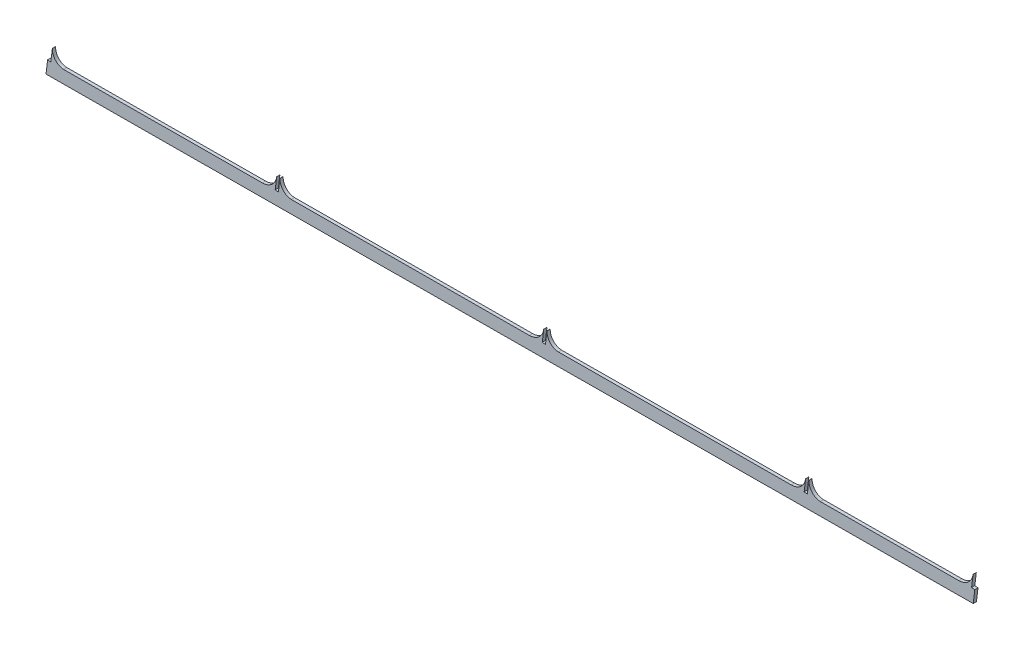
ISO-10303-21;
HEADER;
FILE_DESCRIPTION(('STEP AP214'),'2;1');
FILE_NAME('part.step','',(''),(''),'','','');
FILE_SCHEMA(('AUTOMOTIVE_DESIGN { 1 0 10303 214 1 1 1 1 }'));
ENDSEC;
DATA;
#1=APPLICATION_CONTEXT('core data for automotive mechanical design processes');
#2=APPLICATION_PROTOCOL_DEFINITION('international standard','automotive_design',2000,#1);
#3=PRODUCT_CONTEXT('',#1,'mechanical');
#4=PRODUCT('Part','Part','',(#3));
#5=PRODUCT_RELATED_PRODUCT_CATEGORY('part','',(#4));
#6=PRODUCT_DEFINITION_FORMATION('','',#4);
#7=PRODUCT_DEFINITION_CONTEXT('part definition',#1,'design');
#8=PRODUCT_DEFINITION('design','',#6,#7);
#9=PRODUCT_DEFINITION_SHAPE('','',#8);
#10=(LENGTH_UNIT() NAMED_UNIT(*) SI_UNIT(.MILLI.,.METRE.));
#11=(NAMED_UNIT(*) PLANE_ANGLE_UNIT() SI_UNIT($,.RADIAN.));
#12=(NAMED_UNIT(*) SI_UNIT($,.STERADIAN.) SOLID_ANGLE_UNIT());
#13=UNCERTAINTY_MEASURE_WITH_UNIT(LENGTH_MEASURE(1.E-05),#10,'distance_accuracy_value','');
#14=(GEOMETRIC_REPRESENTATION_CONTEXT(3) GLOBAL_UNCERTAINTY_ASSIGNED_CONTEXT((#13)) GLOBAL_UNIT_ASSIGNED_CONTEXT((#10,
#11,#12)) REPRESENTATION_CONTEXT('',''));
#15=CARTESIAN_POINT('',(0.,0.,0.));
#16=DIRECTION('',(0.,0.,1.));
#17=DIRECTION('',(1.,0.,0.));
#18=AXIS2_PLACEMENT_3D('',#15,#16,#17);
#19=CARTESIAN_POINT('',(571.86296221335,29.8868455378839,2.));
#20=DIRECTION('',(0.,0.,-1.));
#21=DIRECTION('',(-1.,0.,0.));
#22=AXIS2_PLACEMENT_3D('',#19,#20,#21);
#23=CYLINDRICAL_SURFACE('',#22,9.0055703663728);
#24=CARTESIAN_POINT('',(571.86296221335,29.8868455378839,0.));
#25=DIRECTION('',(0.,0.,1.));
#26=DIRECTION('',(1.,0.,0.));
#27=AXIS2_PLACEMENT_3D('',#24,#25,#26);
#28=CIRCLE('',#27,9.0055703663728);
#29=CARTESIAN_POINT('',(571.912079760243,20.8814091192376,0.));
#30=VERTEX_POINT('',#29);
#31=CARTESIAN_POINT('',(580.791756023501,28.7134152163468,0.));
#32=VERTEX_POINT('',#31);
#33=EDGE_CURVE('E248',#30,#32,#28,.T.);
#34=ORIENTED_EDGE('',*,*,#33,.F.);
#35=DIRECTION('',(0.,0.,-1.));
#36=VECTOR('',#35,1.);
#37=CARTESIAN_POINT('',(571.912079760243,20.8814091192376,2.));
#38=LINE('',#37,#36);
#39=CARTESIAN_POINT('',(571.912079760243,20.8814091192376,2.));
#40=VERTEX_POINT('',#39);
#41=EDGE_CURVE('E11',#40,#30,#38,.T.);
#42=ORIENTED_EDGE('',*,*,#41,.F.);
#43=CARTESIAN_POINT('',(571.86296221335,29.8868455378839,2.));
#44=DIRECTION('',(0.,0.,1.));
#45=DIRECTION('',(1.,0.,0.));
#46=AXIS2_PLACEMENT_3D('',#43,#44,#45);
#47=CIRCLE('',#46,9.0055703663728);
#48=CARTESIAN_POINT('',(580.791756023501,28.7134152163468,2.));
#49=VERTEX_POINT('',#48);
#50=EDGE_CURVE('E325',#40,#49,#47,.T.);
#51=ORIENTED_EDGE('',*,*,#50,.T.);
#52=DIRECTION('',(0.,0.,-1.));
#53=VECTOR('',#52,1.);
#54=CARTESIAN_POINT('',(580.791756023501,28.7134152163468,2.));
#55=LINE('',#54,#53);
#56=EDGE_CURVE('E50',#49,#32,#55,.T.);
#57=ORIENTED_EDGE('',*,*,#56,.T.);
#58=EDGE_LOOP('',(#34,#42,#51,#57));
#59=FACE_BOUND('',#58,.T.);
#60=ADVANCED_FACE('F34',(#59),#23,.F.);
#61=CARTESIAN_POINT('',(-0.0968752443684544,17.7615518059578,2.));
#62=DIRECTION('',(-0.00545412948803824,0.999985126125148,0.));
#63=DIRECTION('',(-0.999985126125148,-0.00545412948803824,0.));
#64=AXIS2_PLACEMENT_3D('',#61,#62,#63);
#65=PLANE('',#64);
#66=DIRECTION('',(0.999985126125148,0.00545412948803824,0.));
#67=VECTOR('',#66,1.);
#68=CARTESIAN_POINT('',(-0.0968752443684544,17.7615518059578,0.));
#69=LINE('',#68,#67);
#70=CARTESIAN_POINT('',(485.69022455328,20.4111369614708,0.));
#71=VERTEX_POINT('',#70);
#72=EDGE_CURVE('E250',#71,#30,#69,.T.);
#73=ORIENTED_EDGE('',*,*,#72,.F.);
#74=DIRECTION('',(0.,0.,-1.));
#75=VECTOR('',#74,1.);
#76=CARTESIAN_POINT('',(485.69022455328,20.4111369614708,2.));
#77=LINE('',#76,#75);
#78=CARTESIAN_POINT('',(485.69022455328,20.4111369614708,2.));
#79=VERTEX_POINT('',#78);
#80=EDGE_CURVE('E42',#79,#71,#77,.T.);
#81=ORIENTED_EDGE('',*,*,#80,.F.);
#82=DIRECTION('',(0.999985126125148,0.00545412948803824,0.));
#83=VECTOR('',#82,1.);
#84=CARTESIAN_POINT('',(-0.0968752443684544,17.7615518059578,2.));
#85=LINE('',#84,#83);
#86=EDGE_CURVE('E396',#79,#40,#85,.T.);
#87=ORIENTED_EDGE('',*,*,#86,.T.);
#88=ORIENTED_EDGE('',*,*,#41,.T.);
#89=EDGE_LOOP('',(#73,#81,#87,#88));
#90=FACE_BOUND('',#89,.T.);
#91=ADVANCED_FACE('F385',(#90),#65,.T.);
#92=CARTESIAN_POINT('',(486.110232413012,27.8578242681965,2.));
#93=DIRECTION('',(0.,0.,-1.));
#94=DIRECTION('',(-1.,0.,0.));
#95=AXIS2_PLACEMENT_3D('',#92,#93,#94);
#96=CYLINDRICAL_SURFACE('',#95,7.4585225377676);
#97=CARTESIAN_POINT('',(486.110232413012,27.8578242681965,0.));
#98=DIRECTION('',(0.,0.,1.));
#99=DIRECTION('',(1.,0.,0.));
#100=AXIS2_PLACEMENT_3D('',#97,#98,#99);
#101=CIRCLE('',#100,7.4585225377676);
#102=CARTESIAN_POINT('',(478.665298456165,28.3078429617791,0.));
#103=VERTEX_POINT('',#102);
#104=EDGE_CURVE('E253',#103,#71,#101,.T.);
#105=ORIENTED_EDGE('',*,*,#104,.F.);
#106=DIRECTION('',(0.,0.,-1.));
#107=VECTOR('',#106,1.);
#108=CARTESIAN_POINT('',(478.665298456165,28.3078429617791,2.));
#109=LINE('',#108,#107);
#110=CARTESIAN_POINT('',(478.665298456165,28.3078429617791,2.));
#111=VERTEX_POINT('',#110);
#112=EDGE_CURVE('E374',#111,#103,#109,.T.);
#113=ORIENTED_EDGE('',*,*,#112,.F.);
#114=CARTESIAN_POINT('',(486.110232413012,27.8578242681965,2.));
#115=DIRECTION('',(0.,0.,1.));
#116=DIRECTION('',(1.,0.,0.));
#117=AXIS2_PLACEMENT_3D('',#114,#115,#116);
#118=CIRCLE('',#117,7.4585225377676);
#119=EDGE_CURVE('E381',#111,#79,#118,.T.);
#120=ORIENTED_EDGE('',*,*,#119,.T.);
#121=ORIENTED_EDGE('',*,*,#80,.T.);
#122=EDGE_LOOP('',(#105,#113,#120,#121));
#123=FACE_BOUND('',#122,.T.);
#124=ADVANCED_FACE('F379',(#123),#96,.F.);
#125=CARTESIAN_POINT('',(468.131952417612,-57.4793762221042,2.));
#126=DIRECTION('',(-0.992546151641351,0.121869343404914,0.));
#127=DIRECTION('',(-0.121869343404914,-0.992546151641351,0.));
#128=AXIS2_PLACEMENT_3D('',#125,#126,#127);
#129=PLANE('',#128);
#130=DIRECTION('',(0.121869343404914,0.992546151641351,0.));
#131=VECTOR('',#130,1.);
#132=CARTESIAN_POINT('',(468.131952417612,-57.4793762221042,0.));
#133=LINE('',#132,#131);
#134=CARTESIAN_POINT('',(477.690343708926,20.3674737486484,0.));
#135=VERTEX_POINT('',#134);
#136=EDGE_CURVE('E256',#135,#103,#133,.T.);
#137=ORIENTED_EDGE('',*,*,#136,.F.);
#138=DIRECTION('',(0.,0.,-1.));
#139=VECTOR('',#138,1.);
#140=CARTESIAN_POINT('',(477.690343708926,20.3674737486484,2.));
#141=LINE('',#140,#139);
#142=CARTESIAN_POINT('',(477.690343708926,20.3674737486484,2.));
#143=VERTEX_POINT('',#142);
#144=EDGE_CURVE('E372',#143,#135,#141,.T.);
#145=ORIENTED_EDGE('',*,*,#144,.F.);
#146=DIRECTION('',(0.121869343404914,0.992546151641351,0.));
#147=VECTOR('',#146,1.);
#148=CARTESIAN_POINT('',(468.131952417612,-57.4793762221042,2.));
#149=LINE('',#148,#147);
#150=EDGE_CURVE('E395',#143,#111,#149,.T.);
#151=ORIENTED_EDGE('',*,*,#150,.T.);
#152=ORIENTED_EDGE('',*,*,#112,.T.);
#153=EDGE_LOOP('',(#137,#145,#151,#152));
#154=FACE_BOUND('',#153,.T.);
#155=ADVANCED_FACE('F391',(#154),#129,.T.);
#156=CARTESIAN_POINT('',(9.55839129133681,77.8468499708279,2.));
#157=DIRECTION('',(-0.121869343405077,-0.992546151641331,0.));
#158=DIRECTION('',(0.992546151641331,-0.121869343405077,0.));
#159=AXIS2_PLACEMENT_3D('',#156,#157,#158);
#160=PLANE('',#159);
#161=DIRECTION('',(-0.992546151641331,0.121869343405077,0.));
#162=VECTOR('',#161,1.);
#163=CARTESIAN_POINT('',(9.55839129133681,77.8468499708279,0.));
#164=LINE('',#163,#162);
#165=CARTESIAN_POINT('',(475.708969276083,20.6107559383691,0.));
#166=VERTEX_POINT('',#165);
#167=EDGE_CURVE('E259',#135,#166,#164,.T.);
#168=ORIENTED_EDGE('',*,*,#167,.T.);
#169=DIRECTION('',(0.,0.,-1.));
#170=VECTOR('',#169,1.);
#171=CARTESIAN_POINT('',(475.708969276083,20.6107559383691,2.));
#172=LINE('',#171,#170);
#173=CARTESIAN_POINT('',(475.708969276083,20.6107559383691,2.));
#174=VERTEX_POINT('',#173);
#175=EDGE_CURVE('E370',#174,#166,#172,.T.);
#176=ORIENTED_EDGE('',*,*,#175,.F.);
#177=DIRECTION('',(-0.992546151641331,0.121869343405077,0.));
#178=VECTOR('',#177,1.);
#179=CARTESIAN_POINT('',(9.55839129133681,77.8468499708279,2.));
#180=LINE('',#179,#178);
#181=EDGE_CURVE('E398',#143,#174,#180,.T.);
#182=ORIENTED_EDGE('',*,*,#181,.F.);
#183=ORIENTED_EDGE('',*,*,#144,.T.);
#184=EDGE_LOOP('',(#168,#176,#182,#183));
#185=FACE_BOUND('',#184,.T.);
#186=ADVANCED_FACE('F484',(#185),#160,.F.);
#187=CARTESIAN_POINT('',(466.150577984708,-57.2360940325896,2.));
#188=DIRECTION('',(0.992546151641296,-0.121869343405362,0.));
#189=DIRECTION('',(0.121869343405362,0.992546151641296,0.));
#190=AXIS2_PLACEMENT_3D('',#187,#188,#189);
#191=PLANE('',#190);
#192=DIRECTION('',(-0.121869343405362,-0.992546151641296,0.));
#193=VECTOR('',#192,1.);
#194=CARTESIAN_POINT('',(466.150577984708,-57.2360940325896,0.));
#195=LINE('',#194,#193);
#196=CARTESIAN_POINT('',(476.634048821774,28.1449242318934,0.));
#197=VERTEX_POINT('',#196);
#198=EDGE_CURVE('E262',#197,#166,#195,.T.);
#199=ORIENTED_EDGE('',*,*,#198,.F.);
#200=DIRECTION('',(0.,0.,-1.));
#201=VECTOR('',#200,1.);
#202=CARTESIAN_POINT('',(476.634048821774,28.1449242318934,2.));
#203=LINE('',#202,#201);
#204=CARTESIAN_POINT('',(476.634048821774,28.1449242318934,2.));
#205=VERTEX_POINT('',#204);
#206=EDGE_CURVE('E368',#205,#197,#203,.T.);
#207=ORIENTED_EDGE('',*,*,#206,.F.);
#208=DIRECTION('',(-0.121869343405362,-0.992546151641296,0.));
#209=VECTOR('',#208,1.);
#210=CARTESIAN_POINT('',(466.150577984708,-57.2360940325896,2.));
#211=LINE('',#210,#209);
#212=EDGE_CURVE('E404',#205,#174,#211,.T.);
#213=ORIENTED_EDGE('',*,*,#212,.T.);
#214=ORIENTED_EDGE('',*,*,#175,.T.);
#215=EDGE_LOOP('',(#199,#207,#213,#214));
#216=FACE_BOUND('',#215,.T.);
#217=ADVANCED_FACE('F487',(#216),#191,.T.);
#218=CARTESIAN_POINT('',(467.705255011622,29.3183545534222,2.));
#219=DIRECTION('',(0.,0.,-1.));
#220=DIRECTION('',(-1.,0.,0.));
#221=AXIS2_PLACEMENT_3D('',#218,#219,#220);
#222=CYLINDRICAL_SURFACE('',#221,9.00557036637264);
#223=CARTESIAN_POINT('',(467.705255011622,29.3183545534222,0.));
#224=DIRECTION('',(0.,0.,1.));
#225=DIRECTION('',(1.,0.,0.));
#226=AXIS2_PLACEMENT_3D('',#223,#224,#225);
#227=CIRCLE('',#226,9.00557036637264);
#228=CARTESIAN_POINT('',(467.677868382555,20.3128258295638,0.));
#229=VERTEX_POINT('',#228);
#230=EDGE_CURVE('E265',#229,#197,#227,.T.);
#231=ORIENTED_EDGE('',*,*,#230,.F.);
#232=DIRECTION('',(0.,0.,-1.));
#233=VECTOR('',#232,1.);
#234=CARTESIAN_POINT('',(467.677868382555,20.3128258295638,2.));
#235=LINE('',#234,#233);
#236=CARTESIAN_POINT('',(467.677868382555,20.3128258295638,2.));
#237=VERTEX_POINT('',#236);
#238=EDGE_CURVE('E366',#237,#229,#235,.T.);
#239=ORIENTED_EDGE('',*,*,#238,.F.);
#240=CARTESIAN_POINT('',(467.705255011622,29.3183545534222,2.));
#241=DIRECTION('',(0.,0.,1.));
#242=DIRECTION('',(1.,0.,0.));
#243=AXIS2_PLACEMENT_3D('',#240,#241,#242);
#244=CIRCLE('',#243,9.00557036637264);
#245=EDGE_CURVE('E407',#237,#205,#244,.T.);
#246=ORIENTED_EDGE('',*,*,#245,.T.);
#247=ORIENTED_EDGE('',*,*,#206,.T.);
#248=EDGE_LOOP('',(#231,#239,#246,#247));
#249=FACE_BOUND('',#248,.T.);
#250=ADVANCED_FACE('F491',(#249),#222,.F.);
#251=CARTESIAN_POINT('',(-0.096932242378329,17.7597189682627,2.));
#252=DIRECTION('',(-0.00545790160297811,0.999985105544124,0.));
#253=DIRECTION('',(-0.999985105544124,-0.00545790160297811,0.));
#254=AXIS2_PLACEMENT_3D('',#251,#252,#253);
#255=PLANE('',#254);
#256=DIRECTION('',(0.999985105544124,0.00545790160297811,0.));
#257=VECTOR('',#256,1.);
#258=CARTESIAN_POINT('',(-0.096932242378329,17.7597189682627,0.));
#259=LINE('',#258,#257);
#260=CARTESIAN_POINT('',(322.805939428483,19.5221173191258,0.));
#261=VERTEX_POINT('',#260);
#262=EDGE_CURVE('E268',#261,#229,#259,.T.);
#263=ORIENTED_EDGE('',*,*,#262,.F.);
#264=DIRECTION('',(0.,0.,-1.));
#265=VECTOR('',#264,1.);
#266=CARTESIAN_POINT('',(322.805939428483,19.5221173191258,2.));
#267=LINE('',#266,#265);
#268=CARTESIAN_POINT('',(322.805939428483,19.5221173191258,2.));
#269=VERTEX_POINT('',#268);
#270=EDGE_CURVE('E364',#269,#261,#267,.T.);
#271=ORIENTED_EDGE('',*,*,#270,.F.);
#272=DIRECTION('',(0.999985105544124,0.00545790160297811,0.));
#273=VECTOR('',#272,1.);
#274=CARTESIAN_POINT('',(-0.096932242378329,17.7597189682627,2.));
#275=LINE('',#274,#273);
#276=EDGE_CURVE('E410',#269,#237,#275,.T.);
#277=ORIENTED_EDGE('',*,*,#276,.T.);
#278=ORIENTED_EDGE('',*,*,#238,.T.);
#279=EDGE_LOOP('',(#263,#271,#277,#278));
#280=FACE_BOUND('',#279,.T.);
#281=ADVANCED_FACE('F495',(#280),#255,.T.);
#282=CARTESIAN_POINT('',(323.225947288216,26.9688046258515,2.));
#283=DIRECTION('',(0.,0.,-1.));
#284=DIRECTION('',(-1.,0.,0.));
#285=AXIS2_PLACEMENT_3D('',#282,#283,#284);
#286=CYLINDRICAL_SURFACE('',#285,7.45852253776758);
#287=CARTESIAN_POINT('',(323.225947288216,26.9688046258515,0.));
#288=DIRECTION('',(0.,0.,1.));
#289=DIRECTION('',(1.,0.,0.));
#290=AXIS2_PLACEMENT_3D('',#287,#288,#289);
#291=CIRCLE('',#290,7.45852253776758);
#292=CARTESIAN_POINT('',(315.781013331369,27.4188233194341,0.));
#293=VERTEX_POINT('',#292);
#294=EDGE_CURVE('E271',#293,#261,#291,.T.);
#295=ORIENTED_EDGE('',*,*,#294,.F.);
#296=DIRECTION('',(0.,0.,-1.));
#297=VECTOR('',#296,1.);
#298=CARTESIAN_POINT('',(315.781013331369,27.4188233194341,2.));
#299=LINE('',#298,#297);
#300=CARTESIAN_POINT('',(315.781013331369,27.4188233194341,2.));
#301=VERTEX_POINT('',#300);
#302=EDGE_CURVE('E362',#301,#293,#299,.T.);
#303=ORIENTED_EDGE('',*,*,#302,.F.);
#304=CARTESIAN_POINT('',(323.225947288216,26.9688046258515,2.));
#305=DIRECTION('',(0.,0.,1.));
#306=DIRECTION('',(1.,0.,0.));
#307=AXIS2_PLACEMENT_3D('',#304,#305,#306);
#308=CIRCLE('',#307,7.45852253776758);
#309=EDGE_CURVE('E413',#301,#269,#308,.T.);
#310=ORIENTED_EDGE('',*,*,#309,.T.);
#311=ORIENTED_EDGE('',*,*,#270,.T.);
#312=EDGE_LOOP('',(#295,#303,#310,#311));
#313=FACE_BOUND('',#312,.T.);
#314=ADVANCED_FACE('F499',(#313),#286,.F.);
#315=CARTESIAN_POINT('',(307.774383646617,-37.7899425533892,2.));
#316=DIRECTION('',(-0.992546151641253,0.121869343405711,0.));
#317=DIRECTION('',(-0.121869343405711,-0.992546151641253,0.));
#318=AXIS2_PLACEMENT_3D('',#315,#316,#317);
#319=PLANE('',#318);
#320=DIRECTION('',(0.121869343405711,0.992546151641253,0.));
#321=VECTOR('',#320,1.);
#322=CARTESIAN_POINT('',(307.774383646617,-37.7899425533892,0.));
#323=LINE('',#322,#321);
#324=CARTESIAN_POINT('',(314.806058584123,19.4784541063042,0.));
#325=VERTEX_POINT('',#324);
#326=EDGE_CURVE('E274',#325,#293,#323,.T.);
#327=ORIENTED_EDGE('',*,*,#326,.F.);
#328=DIRECTION('',(0.,0.,-1.));
#329=VECTOR('',#328,1.);
#330=CARTESIAN_POINT('',(314.806058584123,19.4784541063042,2.));
#331=LINE('',#330,#329);
#332=CARTESIAN_POINT('',(314.806058584123,19.4784541063042,2.));
#333=VERTEX_POINT('',#332);
#334=EDGE_CURVE('E360',#333,#325,#331,.T.);
#335=ORIENTED_EDGE('',*,*,#334,.F.);
#336=DIRECTION('',(0.121869343405711,0.992546151641253,0.));
#337=VECTOR('',#336,1.);
#338=CARTESIAN_POINT('',(307.774383646617,-37.7899425533892,2.));
#339=LINE('',#338,#337);
#340=EDGE_CURVE('E416',#333,#301,#339,.T.);
#341=ORIENTED_EDGE('',*,*,#340,.T.);
#342=ORIENTED_EDGE('',*,*,#302,.T.);
#343=EDGE_LOOP('',(#327,#335,#341,#342));
#344=FACE_BOUND('',#343,.T.);
#345=ADVANCED_FACE('F503',(#344),#319,.T.);
#346=CARTESIAN_POINT('',(7.03167493744612,57.2683966595014,2.));
#347=DIRECTION('',(-0.121869343405077,-0.992546151641331,0.));
#348=DIRECTION('',(0.992546151641331,-0.121869343405077,0.));
#349=AXIS2_PLACEMENT_3D('',#346,#347,#348);
#350=PLANE('',#349);
#351=DIRECTION('',(-0.992546151641331,0.121869343405077,0.));
#352=VECTOR('',#351,1.);
#353=CARTESIAN_POINT('',(7.03167493744612,57.2683966595014,0.));
#354=LINE('',#353,#352);
#355=CARTESIAN_POINT('',(312.824684151282,19.7217362960247,0.));
#356=VERTEX_POINT('',#355);
#357=EDGE_CURVE('E277',#325,#356,#354,.T.);
#358=ORIENTED_EDGE('',*,*,#357,.T.);
#359=DIRECTION('',(0.,0.,-1.));
#360=VECTOR('',#359,1.);
#361=CARTESIAN_POINT('',(312.824684151282,19.7217362960247,2.));
#362=LINE('',#361,#360);
#363=CARTESIAN_POINT('',(312.824684151282,19.7217362960247,2.));
#364=VERTEX_POINT('',#363);
#365=EDGE_CURVE('E358',#364,#356,#362,.T.);
#366=ORIENTED_EDGE('',*,*,#365,.F.);
#367=DIRECTION('',(-0.992546151641331,0.121869343405077,0.));
#368=VECTOR('',#367,1.);
#369=CARTESIAN_POINT('',(7.03167493744612,57.2683966595014,2.));
#370=LINE('',#369,#368);
#371=EDGE_CURVE('E419',#333,#364,#370,.T.);
#372=ORIENTED_EDGE('',*,*,#371,.F.);
#373=ORIENTED_EDGE('',*,*,#334,.T.);
#374=EDGE_LOOP('',(#358,#366,#372,#373));
#375=FACE_BOUND('',#374,.T.);
#376=ADVANCED_FACE('F507',(#375),#350,.F.);
#377=CARTESIAN_POINT('',(305.793009213809,-37.5466603635634,2.));
#378=DIRECTION('',(0.992546151641295,-0.121869343405365,0.));
#379=DIRECTION('',(0.121869343405365,0.992546151641295,0.));
#380=AXIS2_PLACEMENT_3D('',#377,#378,#379);
#381=PLANE('',#380);
#382=DIRECTION('',(-0.121869343405365,-0.992546151641295,0.));
#383=VECTOR('',#382,1.);
#384=CARTESIAN_POINT('',(305.793009213809,-37.5466603635634,0.));
#385=LINE('',#384,#383);
#386=CARTESIAN_POINT('',(313.749763696973,27.2559045895474,0.));
#387=VERTEX_POINT('',#386);
#388=EDGE_CURVE('E280',#387,#356,#385,.T.);
#389=ORIENTED_EDGE('',*,*,#388,.F.);
#390=DIRECTION('',(0.,0.,-1.));
#391=VECTOR('',#390,1.);
#392=CARTESIAN_POINT('',(313.749763696973,27.2559045895474,2.));
#393=LINE('',#392,#391);
#394=CARTESIAN_POINT('',(313.749763696973,27.2559045895474,2.));
#395=VERTEX_POINT('',#394);
#396=EDGE_CURVE('E356',#395,#387,#393,.T.);
#397=ORIENTED_EDGE('',*,*,#396,.F.);
#398=DIRECTION('',(-0.121869343405365,-0.992546151641295,0.));
#399=VECTOR('',#398,1.);
#400=CARTESIAN_POINT('',(305.793009213809,-37.5466603635634,2.));
#401=LINE('',#400,#399);
#402=EDGE_CURVE('E421',#395,#364,#401,.T.);
#403=ORIENTED_EDGE('',*,*,#402,.T.);
#404=ORIENTED_EDGE('',*,*,#365,.T.);
#405=EDGE_LOOP('',(#389,#397,#403,#404));
#406=FACE_BOUND('',#405,.T.);
#407=ADVANCED_FACE('F511',(#406),#381,.T.);
#408=CARTESIAN_POINT('',(304.820969886821,28.4293349110772,2.));
#409=DIRECTION('',(0.,0.,-1.));
#410=DIRECTION('',(-1.,0.,0.));
#411=AXIS2_PLACEMENT_3D('',#408,#409,#410);
#412=CYLINDRICAL_SURFACE('',#411,9.00557036637266);
#413=CARTESIAN_POINT('',(304.820969886821,28.4293349110772,0.));
#414=DIRECTION('',(0.,0.,1.));
#415=DIRECTION('',(1.,0.,0.));
#416=AXIS2_PLACEMENT_3D('',#413,#414,#415);
#417=CIRCLE('',#416,9.00557036637266);
#418=CARTESIAN_POINT('',(304.793583257754,19.4238061872189,0.));
#419=VERTEX_POINT('',#418);
#420=EDGE_CURVE('E283',#419,#387,#417,.T.);
#421=ORIENTED_EDGE('',*,*,#420,.F.);
#422=DIRECTION('',(0.,0.,-1.));
#423=VECTOR('',#422,1.);
#424=CARTESIAN_POINT('',(304.793583257754,19.4238061872189,2.));
#425=LINE('',#424,#423);
#426=CARTESIAN_POINT('',(304.793583257754,19.4238061872189,2.));
#427=VERTEX_POINT('',#426);
#428=EDGE_CURVE('E354',#427,#419,#425,.T.);
#429=ORIENTED_EDGE('',*,*,#428,.F.);
#430=CARTESIAN_POINT('',(304.820969886821,28.4293349110772,2.));
#431=DIRECTION('',(0.,0.,1.));
#432=DIRECTION('',(1.,0.,0.));
#433=AXIS2_PLACEMENT_3D('',#430,#431,#432);
#434=CIRCLE('',#433,9.00557036637266);
#435=EDGE_CURVE('E424',#427,#395,#434,.T.);
#436=ORIENTED_EDGE('',*,*,#435,.T.);
#437=ORIENTED_EDGE('',*,*,#396,.T.);
#438=EDGE_LOOP('',(#421,#429,#436,#437));
#439=FACE_BOUND('',#438,.T.);
#440=ADVANCED_FACE('F515',(#439),#412,.F.);
#441=CARTESIAN_POINT('',(-0.0969322423781985,17.7597189682669,2.));
#442=DIRECTION('',(-0.00545790160296949,0.999985105544124,0.));
#443=DIRECTION('',(-0.999985105544124,-0.00545790160296949,0.));
#444=AXIS2_PLACEMENT_3D('',#441,#442,#443);
#445=PLANE('',#444);
#446=DIRECTION('',(0.999985105544124,0.00545790160296949,0.));
#447=VECTOR('',#446,1.);
#448=CARTESIAN_POINT('',(-0.0969322423781985,17.7597189682669,0.));
#449=LINE('',#448,#447);
#450=CARTESIAN_POINT('',(156.683570495634,18.6154242707399,0.));
#451=VERTEX_POINT('',#450);
#452=EDGE_CURVE('E286',#451,#419,#449,.T.);
#453=ORIENTED_EDGE('',*,*,#452,.F.);
#454=DIRECTION('',(0.,0.,-1.));
#455=VECTOR('',#454,1.);
#456=CARTESIAN_POINT('',(156.683570495634,18.6154242707399,2.));
#457=LINE('',#456,#455);
#458=CARTESIAN_POINT('',(156.683570495634,18.6154242707399,2.));
#459=VERTEX_POINT('',#458);
#460=EDGE_CURVE('E352',#459,#451,#457,.T.);
#461=ORIENTED_EDGE('',*,*,#460,.F.);
#462=DIRECTION('',(0.999985105544124,0.00545790160296949,0.));
#463=VECTOR('',#462,1.);
#464=CARTESIAN_POINT('',(-0.0969322423781985,17.7597189682669,2.));
#465=LINE('',#464,#463);
#466=EDGE_CURVE('E427',#459,#427,#465,.T.);
#467=ORIENTED_EDGE('',*,*,#466,.T.);
#468=ORIENTED_EDGE('',*,*,#428,.T.);
#469=EDGE_LOOP('',(#453,#461,#467,#468));
#470=FACE_BOUND('',#469,.T.);
#471=ADVANCED_FACE('F519',(#470),#445,.T.);
#472=CARTESIAN_POINT('',(157.103578355367,26.0621115774657,2.));
#473=DIRECTION('',(0.,0.,-1.));
#474=DIRECTION('',(-1.,0.,0.));
#475=AXIS2_PLACEMENT_3D('',#472,#473,#474);
#476=CYLINDRICAL_SURFACE('',#475,7.45852253776765);
#477=CARTESIAN_POINT('',(157.103578355367,26.0621115774657,0.));
#478=DIRECTION('',(0.,0.,1.));
#479=DIRECTION('',(1.,0.,0.));
#480=AXIS2_PLACEMENT_3D('',#477,#478,#479);
#481=CIRCLE('',#480,7.45852253776765);
#482=CARTESIAN_POINT('',(149.65864439852,26.512130271048,0.));
#483=VERTEX_POINT('',#482);
#484=EDGE_CURVE('E289',#483,#451,#481,.T.);
#485=ORIENTED_EDGE('',*,*,#484,.F.);
#486=DIRECTION('',(0.,0.,-1.));
#487=VECTOR('',#486,1.);
#488=CARTESIAN_POINT('',(149.65864439852,26.512130271048,2.));
#489=LINE('',#488,#487);
#490=CARTESIAN_POINT('',(149.65864439852,26.512130271048,2.));
#491=VERTEX_POINT('',#490);
#492=EDGE_CURVE('E350',#491,#483,#489,.T.);
#493=ORIENTED_EDGE('',*,*,#492,.F.);
#494=CARTESIAN_POINT('',(157.103578355367,26.0621115774657,2.));
#495=DIRECTION('',(0.,0.,1.));
#496=DIRECTION('',(1.,0.,0.));
#497=AXIS2_PLACEMENT_3D('',#494,#495,#496);
#498=CIRCLE('',#497,7.45852253776765);
#499=EDGE_CURVE('E430',#491,#459,#498,.T.);
#500=ORIENTED_EDGE('',*,*,#499,.T.);
#501=ORIENTED_EDGE('',*,*,#460,.T.);
#502=EDGE_LOOP('',(#485,#493,#500,#501));
#503=FACE_BOUND('',#502,.T.);
#504=ADVANCED_FACE('F523',(#503),#476,.F.);
#505=CARTESIAN_POINT('',(144.228961323554,-17.7090896855924,2.));
#506=DIRECTION('',(-0.992546151641324,0.121869343405133,0.));
#507=DIRECTION('',(-0.121869343405133,-0.992546151641324,0.));
#508=AXIS2_PLACEMENT_3D('',#505,#506,#507);
#509=PLANE('',#508);
#510=DIRECTION('',(0.121869343405133,0.992546151641324,0.));
#511=VECTOR('',#510,1.);
#512=CARTESIAN_POINT('',(144.228961323554,-17.7090896855924,0.));
#513=LINE('',#512,#511);
#514=CARTESIAN_POINT('',(148.683689651279,18.5717610579173,0.));
#515=VERTEX_POINT('',#514);
#516=EDGE_CURVE('E292',#515,#483,#513,.T.);
#517=ORIENTED_EDGE('',*,*,#516,.F.);
#518=DIRECTION('',(0.,0.,-1.));
#519=VECTOR('',#518,1.);
#520=CARTESIAN_POINT('',(148.683689651279,18.5717610579173,2.));
#521=LINE('',#520,#519);
#522=CARTESIAN_POINT('',(148.683689651279,18.5717610579173,2.));
#523=VERTEX_POINT('',#522);
#524=EDGE_CURVE('E348',#523,#515,#521,.T.);
#525=ORIENTED_EDGE('',*,*,#524,.F.);
#526=DIRECTION('',(0.121869343405133,0.992546151641324,0.));
#527=VECTOR('',#526,1.);
#528=CARTESIAN_POINT('',(144.228961323554,-17.7090896855924,2.));
#529=LINE('',#528,#527);
#530=EDGE_CURVE('E433',#523,#491,#529,.T.);
#531=ORIENTED_EDGE('',*,*,#530,.T.);
#532=ORIENTED_EDGE('',*,*,#492,.T.);
#533=EDGE_LOOP('',(#517,#525,#531,#532));
#534=FACE_BOUND('',#533,.T.);
#535=ADVANCED_FACE('F527',(#534),#509,.T.);
#536=CARTESIAN_POINT('',(4.45472832772806,36.2808507435173,2.));
#537=DIRECTION('',(-0.121869343405187,-0.992546151641317,0.));
#538=DIRECTION('',(0.992546151641317,-0.121869343405187,0.));
#539=AXIS2_PLACEMENT_3D('',#536,#537,#538);
#540=PLANE('',#539);
#541=DIRECTION('',(-0.992546151641317,0.121869343405187,0.));
#542=VECTOR('',#541,1.);
#543=CARTESIAN_POINT('',(4.45472832772806,36.2808507435173,0.));
#544=LINE('',#543,#542);
#545=CARTESIAN_POINT('',(146.702315218436,18.8150432476383,0.));
#546=VERTEX_POINT('',#545);
#547=EDGE_CURVE('E295',#515,#546,#544,.T.);
#548=ORIENTED_EDGE('',*,*,#547,.T.);
#549=DIRECTION('',(0.,0.,-1.));
#550=VECTOR('',#549,1.);
#551=CARTESIAN_POINT('',(146.702315218436,18.8150432476383,2.));
#552=LINE('',#551,#550);
#553=CARTESIAN_POINT('',(146.702315218436,18.8150432476383,2.));
#554=VERTEX_POINT('',#553);
#555=EDGE_CURVE('E346',#554,#546,#552,.T.);
#556=ORIENTED_EDGE('',*,*,#555,.F.);
#557=DIRECTION('',(-0.992546151641317,0.121869343405187,0.));
#558=VECTOR('',#557,1.);
#559=CARTESIAN_POINT('',(4.45472832772806,36.2808507435173,2.));
#560=LINE('',#559,#558);
#561=EDGE_CURVE('E436',#523,#554,#560,.T.);
#562=ORIENTED_EDGE('',*,*,#561,.F.);
#563=ORIENTED_EDGE('',*,*,#524,.T.);
#564=EDGE_LOOP('',(#548,#556,#562,#563));
#565=FACE_BOUND('',#564,.T.);
#566=ADVANCED_FACE('F531',(#565),#540,.F.);
#567=CARTESIAN_POINT('',(142.247586890697,-17.4658074959058,2.));
#568=DIRECTION('',(0.992546151641294,-0.121869343405379,0.));
#569=DIRECTION('',(0.121869343405379,0.992546151641294,0.));
#570=AXIS2_PLACEMENT_3D('',#567,#568,#569);
#571=PLANE('',#570);
#572=DIRECTION('',(-0.121869343405379,-0.992546151641294,0.));
#573=VECTOR('',#572,1.);
#574=CARTESIAN_POINT('',(142.247586890697,-17.4658074959058,0.));
#575=LINE('',#574,#573);
#576=CARTESIAN_POINT('',(147.627394764126,26.349211541154,0.));
#577=VERTEX_POINT('',#576);
#578=EDGE_CURVE('E298',#577,#546,#575,.T.);
#579=ORIENTED_EDGE('',*,*,#578,.F.);
#580=DIRECTION('',(0.,0.,-1.));
#581=VECTOR('',#580,1.);
#582=CARTESIAN_POINT('',(147.627394764126,26.349211541154,2.));
#583=LINE('',#582,#581);
#584=CARTESIAN_POINT('',(147.627394764126,26.349211541154,2.));
#585=VERTEX_POINT('',#584);
#586=EDGE_CURVE('E344',#585,#577,#583,.T.);
#587=ORIENTED_EDGE('',*,*,#586,.F.);
#588=DIRECTION('',(-0.121869343405379,-0.992546151641294,0.));
#589=VECTOR('',#588,1.);
#590=CARTESIAN_POINT('',(142.247586890697,-17.4658074959058,2.));
#591=LINE('',#590,#589);
#592=EDGE_CURVE('E438',#585,#554,#591,.T.);
#593=ORIENTED_EDGE('',*,*,#592,.T.);
#594=ORIENTED_EDGE('',*,*,#555,.T.);
#595=EDGE_LOOP('',(#579,#587,#593,#594));
#596=FACE_BOUND('',#595,.T.);
#597=ADVANCED_FACE('F535',(#596),#571,.T.);
#598=CARTESIAN_POINT('',(138.698600953975,27.5226418626902,2.));
#599=DIRECTION('',(0.,0.,-1.));
#600=DIRECTION('',(-1.,0.,0.));
#601=AXIS2_PLACEMENT_3D('',#598,#599,#600);
#602=CYLINDRICAL_SURFACE('',#601,9.00557036637265);
#603=CARTESIAN_POINT('',(138.698600953975,27.5226418626902,0.));
#604=DIRECTION('',(0.,0.,1.));
#605=DIRECTION('',(1.,0.,0.));
#606=AXIS2_PLACEMENT_3D('',#603,#604,#605);
#607=CIRCLE('',#606,9.00557036637265);
#608=CARTESIAN_POINT('',(138.671214324908,18.5171131388318,0.));
#609=VERTEX_POINT('',#608);
#610=EDGE_CURVE('E301',#609,#577,#607,.T.);
#611=ORIENTED_EDGE('',*,*,#610,.F.);
#612=DIRECTION('',(0.,0.,-1.));
#613=VECTOR('',#612,1.);
#614=CARTESIAN_POINT('',(138.671214324908,18.5171131388318,2.));
#615=LINE('',#614,#613);
#616=CARTESIAN_POINT('',(138.671214324908,18.5171131388318,2.));
#617=VERTEX_POINT('',#616);
#618=EDGE_CURVE('E342',#617,#609,#615,.T.);
#619=ORIENTED_EDGE('',*,*,#618,.F.);
#620=CARTESIAN_POINT('',(138.698600953975,27.5226418626902,2.));
#621=DIRECTION('',(0.,0.,1.));
#622=DIRECTION('',(1.,0.,0.));
#623=AXIS2_PLACEMENT_3D('',#620,#621,#622);
#624=CIRCLE('',#623,9.00557036637265);
#625=EDGE_CURVE('E441',#617,#585,#624,.T.);
#626=ORIENTED_EDGE('',*,*,#625,.T.);
#627=ORIENTED_EDGE('',*,*,#586,.T.);
#628=EDGE_LOOP('',(#611,#619,#626,#627));
#629=FACE_BOUND('',#628,.T.);
#630=ADVANCED_FACE('F539',(#629),#602,.F.);
#631=CARTESIAN_POINT('',(-0.0969322423781684,17.7597189682673,2.));
#632=DIRECTION('',(-0.00545790160296765,0.999985105544124,0.));
#633=DIRECTION('',(-0.999985105544124,-0.00545790160296765,0.));
#634=AXIS2_PLACEMENT_3D('',#631,#632,#633);
#635=PLANE('',#634);
#636=DIRECTION('',(0.999985105544124,0.00545790160296765,0.));
#637=VECTOR('',#636,1.);
#638=CARTESIAN_POINT('',(-0.0969322423781684,17.7597189682673,0.));
#639=LINE('',#638,#637);
#640=CARTESIAN_POINT('',(15.1250438666505,17.8428002535237,0.));
#641=VERTEX_POINT('',#640);
#642=EDGE_CURVE('E304',#641,#609,#639,.T.);
#643=ORIENTED_EDGE('',*,*,#642,.F.);
#644=DIRECTION('',(0.,0.,-1.));
#645=VECTOR('',#644,1.);
#646=CARTESIAN_POINT('',(15.1250438666505,17.8428002535237,2.));
#647=LINE('',#646,#645);
#648=CARTESIAN_POINT('',(15.1250438666505,17.8428002535237,2.));
#649=VERTEX_POINT('',#648);
#650=EDGE_CURVE('E340',#649,#641,#647,.T.);
#651=ORIENTED_EDGE('',*,*,#650,.F.);
#652=DIRECTION('',(0.999985105544124,0.00545790160296765,0.));
#653=VECTOR('',#652,1.);
#654=CARTESIAN_POINT('',(-0.0969322423781684,17.7597189682673,2.));
#655=LINE('',#654,#653);
#656=EDGE_CURVE('E444',#649,#617,#655,.T.);
#657=ORIENTED_EDGE('',*,*,#656,.T.);
#658=ORIENTED_EDGE('',*,*,#618,.T.);
#659=EDGE_LOOP('',(#643,#651,#657,#658));
#660=FACE_BOUND('',#659,.T.);
#661=ADVANCED_FACE('F543',(#660),#635,.T.);
#662=CARTESIAN_POINT('',(15.5450517263835,25.2894875602495,2.));
#663=DIRECTION('',(0.,0.,-1.));
#664=DIRECTION('',(-1.,0.,0.));
#665=AXIS2_PLACEMENT_3D('',#662,#663,#664);
#666=CYLINDRICAL_SURFACE('',#665,7.45852253776767);
#667=CARTESIAN_POINT('',(15.5450517263835,25.2894875602495,0.));
#668=DIRECTION('',(0.,0.,1.));
#669=DIRECTION('',(1.,0.,0.));
#670=AXIS2_PLACEMENT_3D('',#667,#668,#669);
#671=CIRCLE('',#670,7.45852253776767);
#672=CARTESIAN_POINT('',(8.10011776953644,25.7395062538318,0.));
#673=VERTEX_POINT('',#672);
#674=EDGE_CURVE('E307',#673,#641,#671,.T.);
#675=ORIENTED_EDGE('',*,*,#674,.F.);
#676=DIRECTION('',(0.,0.,-1.));
#677=VECTOR('',#676,1.);
#678=CARTESIAN_POINT('',(8.10011776953644,25.7395062538318,2.));
#679=LINE('',#678,#677);
#680=CARTESIAN_POINT('',(8.10011776953644,25.7395062538318,2.));
#681=VERTEX_POINT('',#680);
#682=EDGE_CURVE('E338',#681,#673,#679,.T.);
#683=ORIENTED_EDGE('',*,*,#682,.F.);
#684=CARTESIAN_POINT('',(15.5450517263835,25.2894875602495,2.));
#685=DIRECTION('',(0.,0.,1.));
#686=DIRECTION('',(1.,0.,0.));
#687=AXIS2_PLACEMENT_3D('',#684,#685,#686);
#688=CIRCLE('',#687,7.45852253776767);
#689=EDGE_CURVE('E447',#681,#649,#688,.T.);
#690=ORIENTED_EDGE('',*,*,#689,.T.);
#691=ORIENTED_EDGE('',*,*,#650,.T.);
#692=EDGE_LOOP('',(#675,#683,#690,#691));
#693=FACE_BOUND('',#692,.T.);
#694=ADVANCED_FACE('F547',(#693),#666,.F.);
#695=CARTESIAN_POINT('',(4.86633863946202,-0.597511253051125,2.));
#696=DIRECTION('',(0.992546151641323,-0.121869343405136,0.));
#697=DIRECTION('',(0.121869343405136,0.992546151641324,0.));
#698=AXIS2_PLACEMENT_3D('',#695,#696,#697);
#699=PLANE('',#698);
#700=DIRECTION('',(-0.121869343405136,-0.992546151641324,0.));
#701=VECTOR('',#700,1.);
#702=CARTESIAN_POINT('',(4.86633863946202,-0.597511253051125,0.));
#703=LINE('',#702,#701);
#704=CARTESIAN_POINT('',(7.12516302229534,17.7991370407011,0.));
#705=VERTEX_POINT('',#704);
#706=EDGE_CURVE('E310',#673,#705,#703,.T.);
#707=ORIENTED_EDGE('',*,*,#706,.T.);
#708=DIRECTION('',(0.,0.,-1.));
#709=VECTOR('',#708,1.);
#710=CARTESIAN_POINT('',(7.12516302229534,17.7991370407011,2.));
#711=LINE('',#710,#709);
#712=CARTESIAN_POINT('',(7.12516302229534,17.7991370407011,2.));
#713=VERTEX_POINT('',#712);
#714=EDGE_CURVE('E335',#713,#705,#711,.T.);
#715=ORIENTED_EDGE('',*,*,#714,.F.);
#716=DIRECTION('',(-0.121869343405136,-0.992546151641324,0.));
#717=VECTOR('',#716,1.);
#718=CARTESIAN_POINT('',(4.86633863946202,-0.597511253051125,2.));
#719=LINE('',#718,#717);
#720=EDGE_CURVE('E450',#681,#713,#719,.T.);
#721=ORIENTED_EDGE('',*,*,#720,.F.);
#722=ORIENTED_EDGE('',*,*,#682,.T.);
#723=EDGE_LOOP('',(#707,#715,#721,#722));
#724=FACE_BOUND('',#723,.T.);
#725=ADVANCED_FACE('F551',(#724),#699,.F.);
#726=CARTESIAN_POINT('',(2.25882438283541,18.3966482937525,2.));
#727=DIRECTION('',(-0.121869343405245,-0.99254615164131,0.));
#728=DIRECTION('',(0.99254615164131,-0.121869343405245,0.));
#729=AXIS2_PLACEMENT_3D('',#726,#727,#728);
#730=PLANE('',#729);
#731=DIRECTION('',(-0.99254615164131,0.121869343405245,0.));
#732=VECTOR('',#731,1.);
#733=CARTESIAN_POINT('',(2.25882438283541,18.3966482937525,0.));
#734=LINE('',#733,#732);
#735=CARTESIAN_POINT('',(5.14378858945139,18.0424192304223,0.));
#736=VERTEX_POINT('',#735);
#737=EDGE_CURVE('E312',#705,#736,#734,.T.);
#738=ORIENTED_EDGE('',*,*,#737,.T.);
#739=DIRECTION('',(0.,0.,-1.));
#740=VECTOR('',#739,1.);
#741=CARTESIAN_POINT('',(5.14378858945139,18.0424192304223,2.));
#742=LINE('',#741,#740);
#743=CARTESIAN_POINT('',(5.14378858945139,18.0424192304223,2.));
#744=VERTEX_POINT('',#743);
#745=EDGE_CURVE('E332',#744,#736,#742,.T.);
#746=ORIENTED_EDGE('',*,*,#745,.F.);
#747=DIRECTION('',(-0.99254615164131,0.121869343405245,0.));
#748=VECTOR('',#747,1.);
#749=CARTESIAN_POINT('',(2.25882438283541,18.3966482937525,2.));
#750=LINE('',#749,#748);
#751=EDGE_CURVE('E452',#713,#744,#750,.T.);
#752=ORIENTED_EDGE('',*,*,#751,.F.);
#753=ORIENTED_EDGE('',*,*,#714,.T.);
#754=EDGE_LOOP('',(#738,#746,#752,#753));
#755=FACE_BOUND('',#754,.T.);
#756=ADVANCED_FACE('F555',(#755),#730,.F.);
#757=CARTESIAN_POINT('',(2.88496420661582,-0.354229063330234,2.));
#758=DIRECTION('',(0.992546151641309,-0.121869343405254,0.));
#759=DIRECTION('',(0.121869343405254,0.992546151641309,0.));
#760=AXIS2_PLACEMENT_3D('',#757,#758,#759);
#761=PLANE('',#760);
#762=DIRECTION('',(-0.121869343405254,-0.992546151641309,0.));
#763=VECTOR('',#762,1.);
#764=CARTESIAN_POINT('',(2.88496420661582,-0.354229063330234,0.));
#765=LINE('',#764,#763);
#766=CARTESIAN_POINT('',(4.13761379303406,9.84778312131002,0.));
#767=VERTEX_POINT('',#766);
#768=EDGE_CURVE('E314',#736,#767,#765,.T.);
#769=ORIENTED_EDGE('',*,*,#768,.T.);
#770=DIRECTION('',(0.,0.,-1.));
#771=VECTOR('',#770,1.);
#772=CARTESIAN_POINT('',(4.13761379303406,9.84778312131002,2.));
#773=LINE('',#772,#771);
#774=CARTESIAN_POINT('',(4.13761379303406,9.84778312131002,2.));
#775=VERTEX_POINT('',#774);
#776=EDGE_CURVE('E329',#775,#767,#773,.T.);
#777=ORIENTED_EDGE('',*,*,#776,.F.);
#778=DIRECTION('',(-0.121869343405254,-0.992546151641309,0.));
#779=VECTOR('',#778,1.);
#780=CARTESIAN_POINT('',(2.88496420661582,-0.354229063330234,2.));
#781=LINE('',#780,#779);
#782=EDGE_CURVE('E243',#744,#775,#781,.T.);
#783=ORIENTED_EDGE('',*,*,#782,.F.);
#784=ORIENTED_EDGE('',*,*,#745,.T.);
#785=EDGE_LOOP('',(#769,#777,#783,#784));
#786=FACE_BOUND('',#785,.T.);
#787=ADVANCED_FACE('F458',(#786),#761,.F.);
#788=CARTESIAN_POINT('',(-0.0536241766385602,9.82490741615575,2.));
#789=DIRECTION('',(-0.00545790160296583,0.999985105544124,0.));
#790=DIRECTION('',(-0.999985105544124,-0.00545790160296583,0.));
#791=AXIS2_PLACEMENT_3D('',#788,#789,#790);
#792=PLANE('',#791);
#793=DIRECTION('',(0.999985105544124,0.00545790160296583,0.));
#794=VECTOR('',#793,1.);
#795=CARTESIAN_POINT('',(-0.0536241766385602,9.82490741615575,0.));
#796=LINE('',#795,#794);
#797=CARTESIAN_POINT('',(580.873096163411,12.9955955199794,0.));
#798=VERTEX_POINT('',#797);
#799=EDGE_CURVE('E316',#767,#798,#796,.T.);
#800=ORIENTED_EDGE('',*,*,#799,.T.);
#801=DIRECTION('',(0.,0.,-1.));
#802=VECTOR('',#801,1.);
#803=CARTESIAN_POINT('',(580.873096163411,12.9955955199794,2.));
#804=LINE('',#803,#802);
#805=CARTESIAN_POINT('',(580.873096163411,12.9955955199794,2.));
#806=VERTEX_POINT('',#805);
#807=EDGE_CURVE('E230',#806,#798,#804,.T.);
#808=ORIENTED_EDGE('',*,*,#807,.F.);
#809=DIRECTION('',(0.999985105544124,0.00545790160296583,0.));
#810=VECTOR('',#809,1.);
#811=CARTESIAN_POINT('',(-0.0536241766385602,9.82490741615575,2.));
#812=LINE('',#811,#810);
#813=EDGE_CURVE('E240',#775,#806,#812,.T.);
#814=ORIENTED_EDGE('',*,*,#813,.F.);
#815=ORIENTED_EDGE('',*,*,#776,.T.);
#816=EDGE_LOOP('',(#800,#808,#814,#815));
#817=FACE_BOUND('',#816,.T.);
#818=ADVANCED_FACE('F462',(#817),#792,.F.);
#819=CARTESIAN_POINT('',(570.673929888419,-70.069947900078,2.));
#820=DIRECTION('',(0.992546151641323,-0.121869343405136,0.));
#821=DIRECTION('',(0.121869343405136,0.992546151641323,0.));
#822=AXIS2_PLACEMENT_3D('',#819,#820,#821);
#823=PLANE('',#822);
#824=DIRECTION('',(-0.121869343405136,-0.992546151641323,0.));
#825=VECTOR('',#824,1.);
#826=CARTESIAN_POINT('',(570.673929888419,-70.069947900078,0.));
#827=LINE('',#826,#825);
#828=CARTESIAN_POINT('',(581.848050910652,20.9359647331099,0.));
#829=VERTEX_POINT('',#828);
#830=EDGE_CURVE('E227',#829,#798,#827,.T.);
#831=ORIENTED_EDGE('',*,*,#830,.F.);
#832=DIRECTION('',(0.,0.,-1.));
#833=VECTOR('',#832,1.);
#834=CARTESIAN_POINT('',(581.848050910652,20.9359647331099,2.));
#835=LINE('',#834,#833);
#836=CARTESIAN_POINT('',(581.848050910652,20.9359647331099,2.));
#837=VERTEX_POINT('',#836);
#838=EDGE_CURVE('E221',#837,#829,#835,.T.);
#839=ORIENTED_EDGE('',*,*,#838,.F.);
#840=DIRECTION('',(-0.121869343405136,-0.992546151641323,0.));
#841=VECTOR('',#840,1.);
#842=CARTESIAN_POINT('',(570.673929888419,-70.069947900078,2.));
#843=LINE('',#842,#841);
#844=EDGE_CURVE('E225',#837,#806,#843,.T.);
#845=ORIENTED_EDGE('',*,*,#844,.T.);
#846=ORIENTED_EDGE('',*,*,#807,.T.);
#847=EDGE_LOOP('',(#831,#839,#845,#846));
#848=FACE_BOUND('',#847,.T.);
#849=ADVANCED_FACE('F223',(#848),#823,.T.);
#850=CARTESIAN_POINT('',(11.1741210222595,91.00591263328,2.));
#851=DIRECTION('',(-0.1218693434053,-0.992546151641303,0.));
#852=DIRECTION('',(0.992546151641303,-0.1218693434053,0.));
#853=AXIS2_PLACEMENT_3D('',#850,#851,#852);
#854=PLANE('',#853);
#855=DIRECTION('',(-0.992546151641303,0.1218693434053,0.));
#856=VECTOR('',#855,1.);
#857=CARTESIAN_POINT('',(11.1741210222595,91.00591263328,0.));
#858=LINE('',#857,#856);
#859=CARTESIAN_POINT('',(579.866676477811,21.1792469228309,0.));
#860=VERTEX_POINT('',#859);
#861=EDGE_CURVE('E320',#829,#860,#858,.T.);
#862=ORIENTED_EDGE('',*,*,#861,.T.);
#863=DIRECTION('',(0.,0.,-1.));
#864=VECTOR('',#863,1.);
#865=CARTESIAN_POINT('',(579.866676477811,21.1792469228309,2.));
#866=LINE('',#865,#864);
#867=CARTESIAN_POINT('',(579.866676477811,21.1792469228309,2.));
#868=VERTEX_POINT('',#867);
#869=EDGE_CURVE('E136',#868,#860,#866,.T.);
#870=ORIENTED_EDGE('',*,*,#869,.F.);
#871=DIRECTION('',(-0.992546151641303,0.1218693434053,0.));
#872=VECTOR('',#871,1.);
#873=CARTESIAN_POINT('',(11.1741210222595,91.00591263328,2.));
#874=LINE('',#873,#872);
#875=EDGE_CURVE('E232',#837,#868,#874,.T.);
#876=ORIENTED_EDGE('',*,*,#875,.F.);
#877=ORIENTED_EDGE('',*,*,#838,.T.);
#878=EDGE_LOOP('',(#862,#870,#876,#877));
#879=FACE_BOUND('',#878,.T.);
#880=ADVANCED_FACE('F233',(#879),#854,.F.);
#881=CARTESIAN_POINT('',(568.69255545554,-69.8266657104878,2.));
#882=DIRECTION('',(0.992546151641295,-0.121869343405369,0.));
#883=DIRECTION('',(0.121869343405369,0.992546151641295,0.));
#884=AXIS2_PLACEMENT_3D('',#881,#882,#883);
#885=PLANE('',#884);
#886=DIRECTION('',(-0.121869343405369,-0.992546151641295,0.));
#887=VECTOR('',#886,1.);
#888=CARTESIAN_POINT('',(568.69255545554,-69.8266657104878,0.));
#889=LINE('',#888,#887);
#890=EDGE_CURVE('E322',#32,#860,#889,.T.);
#891=ORIENTED_EDGE('',*,*,#890,.F.);
#892=ORIENTED_EDGE('',*,*,#56,.F.);
#893=DIRECTION('',(-0.121869343405369,-0.992546151641295,0.));
#894=VECTOR('',#893,1.);
#895=CARTESIAN_POINT('',(568.69255545554,-69.8266657104878,2.));
#896=LINE('',#895,#894);
#897=EDGE_CURVE('E236',#49,#868,#896,.T.);
#898=ORIENTED_EDGE('',*,*,#897,.T.);
#899=ORIENTED_EDGE('',*,*,#869,.T.);
#900=EDGE_LOOP('',(#891,#892,#898,#899));
#901=FACE_BOUND('',#900,.T.);
#902=ADVANCED_FACE('F463',(#901),#885,.T.);
#903=CARTESIAN_POINT('',(0.,0.,2.));
#904=DIRECTION('',(0.,0.,1.));
#905=DIRECTION('',(1.,0.,0.));
#906=AXIS2_PLACEMENT_3D('',#903,#904,#905);
#907=PLANE('',#906);
#908=ORIENTED_EDGE('',*,*,#50,.F.);
#909=ORIENTED_EDGE('',*,*,#86,.F.);
#910=ORIENTED_EDGE('',*,*,#119,.F.);
#911=ORIENTED_EDGE('',*,*,#150,.F.);
#912=ORIENTED_EDGE('',*,*,#181,.T.);
#913=ORIENTED_EDGE('',*,*,#212,.F.);
#914=ORIENTED_EDGE('',*,*,#245,.F.);
#915=ORIENTED_EDGE('',*,*,#276,.F.);
#916=ORIENTED_EDGE('',*,*,#309,.F.);
#917=ORIENTED_EDGE('',*,*,#340,.F.);
#918=ORIENTED_EDGE('',*,*,#371,.T.);
#919=ORIENTED_EDGE('',*,*,#402,.F.);
#920=ORIENTED_EDGE('',*,*,#435,.F.);
#921=ORIENTED_EDGE('',*,*,#466,.F.);
#922=ORIENTED_EDGE('',*,*,#499,.F.);
#923=ORIENTED_EDGE('',*,*,#530,.F.);
#924=ORIENTED_EDGE('',*,*,#561,.T.);
#925=ORIENTED_EDGE('',*,*,#592,.F.);
#926=ORIENTED_EDGE('',*,*,#625,.F.);
#927=ORIENTED_EDGE('',*,*,#656,.F.);
#928=ORIENTED_EDGE('',*,*,#689,.F.);
#929=ORIENTED_EDGE('',*,*,#720,.T.);
#930=ORIENTED_EDGE('',*,*,#751,.T.);
#931=ORIENTED_EDGE('',*,*,#782,.T.);
#932=ORIENTED_EDGE('',*,*,#813,.T.);
#933=ORIENTED_EDGE('',*,*,#844,.F.);
#934=ORIENTED_EDGE('',*,*,#875,.T.);
#935=ORIENTED_EDGE('',*,*,#897,.F.);
#936=EDGE_LOOP('',(#908,#909,#910,#911,#912,#913,#914,#915,#916,#917,#918,#919,#920,#921,#922,
#923,#924,#925,#926,#927,#928,#929,#930,#931,#932,#933,#934,#935));
#937=FACE_BOUND('',#936,.T.);
#938=ADVANCED_FACE('F238',(#937),#907,.T.);
#939=CARTESIAN_POINT('',(0.,0.,0.));
#940=DIRECTION('',(0.,0.,1.));
#941=DIRECTION('',(1.,0.,0.));
#942=AXIS2_PLACEMENT_3D('',#939,#940,#941);
#943=PLANE('',#942);
#944=ORIENTED_EDGE('',*,*,#33,.T.);
#945=ORIENTED_EDGE('',*,*,#890,.T.);
#946=ORIENTED_EDGE('',*,*,#861,.F.);
#947=ORIENTED_EDGE('',*,*,#830,.T.);
#948=ORIENTED_EDGE('',*,*,#799,.F.);
#949=ORIENTED_EDGE('',*,*,#768,.F.);
#950=ORIENTED_EDGE('',*,*,#737,.F.);
#951=ORIENTED_EDGE('',*,*,#706,.F.);
#952=ORIENTED_EDGE('',*,*,#674,.T.);
#953=ORIENTED_EDGE('',*,*,#642,.T.);
#954=ORIENTED_EDGE('',*,*,#610,.T.);
#955=ORIENTED_EDGE('',*,*,#578,.T.);
#956=ORIENTED_EDGE('',*,*,#547,.F.);
#957=ORIENTED_EDGE('',*,*,#516,.T.);
#958=ORIENTED_EDGE('',*,*,#484,.T.);
#959=ORIENTED_EDGE('',*,*,#452,.T.);
#960=ORIENTED_EDGE('',*,*,#420,.T.);
#961=ORIENTED_EDGE('',*,*,#388,.T.);
#962=ORIENTED_EDGE('',*,*,#357,.F.);
#963=ORIENTED_EDGE('',*,*,#326,.T.);
#964=ORIENTED_EDGE('',*,*,#294,.T.);
#965=ORIENTED_EDGE('',*,*,#262,.T.);
#966=ORIENTED_EDGE('',*,*,#230,.T.);
#967=ORIENTED_EDGE('',*,*,#198,.T.);
#968=ORIENTED_EDGE('',*,*,#167,.F.);
#969=ORIENTED_EDGE('',*,*,#136,.T.);
#970=ORIENTED_EDGE('',*,*,#104,.T.);
#971=ORIENTED_EDGE('',*,*,#72,.T.);
#972=EDGE_LOOP('',(#944,#945,#946,#947,#948,#949,#950,#951,#952,#953,#954,#955,#956,#957,#958,
#959,#960,#961,#962,#963,#964,#965,#966,#967,#968,#969,#970,#971));
#973=FACE_BOUND('',#972,.T.);
#974=ADVANCED_FACE('F387',(#973),#943,.F.);
#975=CLOSED_SHELL('',(#60,#91,#124,#155,#186,#217,#250,#281,#314,#345,#376,#407,#440,#471,#504,
#535,#566,#597,#630,#661,#694,#725,#756,#787,#818,#849,#880,#902,#938,#974));
#976=MANIFOLD_SOLID_BREP('B2',#975);
#977=ADVANCED_BREP_SHAPE_REPRESENTATION('',(#18,#976),#14);
#978=SHAPE_DEFINITION_REPRESENTATION(#9,#977);
ENDSEC;
END-ISO-10303-21;
